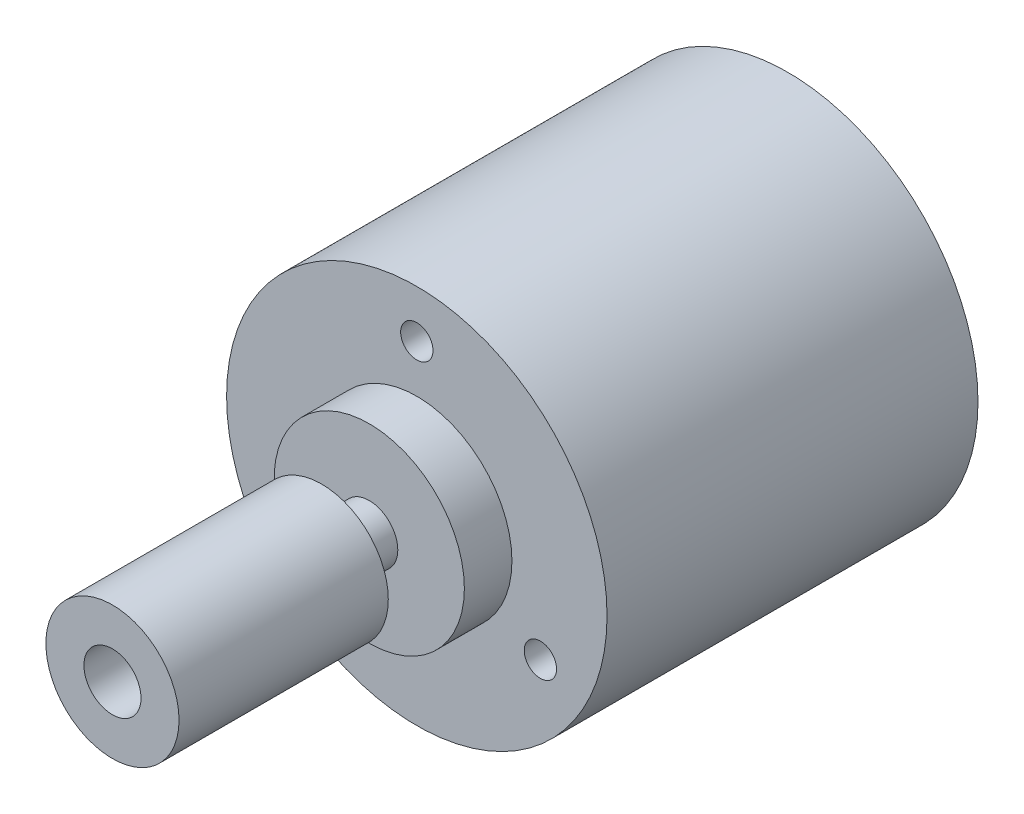
ISO-10303-21;
HEADER;
FILE_DESCRIPTION(('STEP AP214'),'2;1');
FILE_NAME('part.step','',(''),(''),'','','');
FILE_SCHEMA(('AUTOMOTIVE_DESIGN { 1 0 10303 214 1 1 1 1 }'));
ENDSEC;
DATA;
#1=APPLICATION_CONTEXT('core data for automotive mechanical design processes');
#2=APPLICATION_PROTOCOL_DEFINITION('international standard','automotive_design',2000,#1);
#3=PRODUCT_CONTEXT('',#1,'mechanical');
#4=PRODUCT('Part','Part','',(#3));
#5=PRODUCT_RELATED_PRODUCT_CATEGORY('part','',(#4));
#6=PRODUCT_DEFINITION_FORMATION('','',#4);
#7=PRODUCT_DEFINITION_CONTEXT('part definition',#1,'design');
#8=PRODUCT_DEFINITION('design','',#6,#7);
#9=PRODUCT_DEFINITION_SHAPE('','',#8);
#10=(LENGTH_UNIT() NAMED_UNIT(*) SI_UNIT(.MILLI.,.METRE.));
#11=(NAMED_UNIT(*) PLANE_ANGLE_UNIT() SI_UNIT($,.RADIAN.));
#12=(NAMED_UNIT(*) SI_UNIT($,.STERADIAN.) SOLID_ANGLE_UNIT());
#13=UNCERTAINTY_MEASURE_WITH_UNIT(LENGTH_MEASURE(1.E-05),#10,'distance_accuracy_value','');
#14=(GEOMETRIC_REPRESENTATION_CONTEXT(3) GLOBAL_UNCERTAINTY_ASSIGNED_CONTEXT((#13)) GLOBAL_UNIT_ASSIGNED_CONTEXT((#10,
#11,#12)) REPRESENTATION_CONTEXT('',''));
#15=CARTESIAN_POINT('',(0.,0.,0.));
#16=DIRECTION('',(0.,0.,1.));
#17=DIRECTION('',(1.,0.,0.));
#18=AXIS2_PLACEMENT_3D('',#15,#16,#17);
#19=CARTESIAN_POINT('',(0.,0.,10.));
#20=DIRECTION('',(0.,0.,-1.));
#21=DIRECTION('',(-1.,0.,0.));
#22=AXIS2_PLACEMENT_3D('',#19,#20,#21);
#23=CYLINDRICAL_SURFACE('',#22,3.);
#24=CARTESIAN_POINT('',(0.,0.,5.));
#25=DIRECTION('',(0.,0.,1.));
#26=DIRECTION('',(1.,0.,0.));
#27=AXIS2_PLACEMENT_3D('',#24,#25,#26);
#28=CIRCLE('',#27,3.);
#29=CARTESIAN_POINT('',(3.,0.,5.));
#30=VERTEX_POINT('',#29);
#31=EDGE_CURVE('E11',#30,#30,#28,.T.);
#32=ORIENTED_EDGE('',*,*,#31,.T.);
#33=EDGE_LOOP('',(#32));
#34=FACE_BOUND('',#33,.T.);
#35=CARTESIAN_POINT('',(0.,0.,10.));
#36=DIRECTION('',(0.,0.,1.));
#37=DIRECTION('',(1.,0.,0.));
#38=AXIS2_PLACEMENT_3D('',#35,#36,#37);
#39=CIRCLE('',#38,3.);
#40=CARTESIAN_POINT('',(3.,0.,10.));
#41=VERTEX_POINT('',#40);
#42=EDGE_CURVE('E85',#41,#41,#39,.T.);
#43=ORIENTED_EDGE('',*,*,#42,.F.);
#44=EDGE_LOOP('',(#43));
#45=FACE_BOUND('',#44,.T.);
#46=ADVANCED_FACE('F33',(#34,#45),#23,.T.);
#47=CARTESIAN_POINT('',(0.,0.,-39.));
#48=DIRECTION('',(0.,0.,1.));
#49=DIRECTION('',(1.,0.,0.));
#50=AXIS2_PLACEMENT_3D('',#47,#48,#49);
#51=CYLINDRICAL_SURFACE('',#50,20.);
#52=CARTESIAN_POINT('',(0.,0.,-39.));
#53=DIRECTION('',(0.,0.,1.));
#54=DIRECTION('',(1.,0.,0.));
#55=AXIS2_PLACEMENT_3D('',#52,#53,#54);
#56=CIRCLE('',#55,20.);
#57=CARTESIAN_POINT('',(20.,0.,-39.));
#58=VERTEX_POINT('',#57);
#59=EDGE_CURVE('E92',#58,#58,#56,.T.);
#60=ORIENTED_EDGE('',*,*,#59,.T.);
#61=EDGE_LOOP('',(#60));
#62=FACE_BOUND('',#61,.T.);
#63=CARTESIAN_POINT('',(0.,0.,0.));
#64=DIRECTION('',(0.,0.,1.));
#65=DIRECTION('',(1.,0.,0.));
#66=AXIS2_PLACEMENT_3D('',#63,#64,#65);
#67=CIRCLE('',#66,20.);
#68=CARTESIAN_POINT('',(20.,0.,0.));
#69=VERTEX_POINT('',#68);
#70=EDGE_CURVE('E37',#69,#69,#67,.T.);
#71=ORIENTED_EDGE('',*,*,#70,.F.);
#72=EDGE_LOOP('',(#71));
#73=FACE_BOUND('',#72,.T.);
#74=ADVANCED_FACE('F35',(#62,#73),#51,.T.);
#75=CARTESIAN_POINT('',(0.,0.,-39.));
#76=DIRECTION('',(0.,0.,1.));
#77=DIRECTION('',(1.,0.,0.));
#78=AXIS2_PLACEMENT_3D('',#75,#76,#77);
#79=PLANE('',#78);
#80=ORIENTED_EDGE('',*,*,#59,.F.);
#81=EDGE_LOOP('',(#80));
#82=FACE_BOUND('',#81,.T.);
#83=ADVANCED_FACE('F102',(#82),#79,.F.);
#84=CARTESIAN_POINT('',(0.,0.,0.));
#85=DIRECTION('',(0.,0.,1.));
#86=DIRECTION('',(1.,0.,0.));
#87=AXIS2_PLACEMENT_3D('',#84,#85,#86);
#88=PLANE('',#87);
#89=CARTESIAN_POINT('',(0.,15.,0.));
#90=DIRECTION('',(0.,0.,1.));
#91=DIRECTION('',(1.,0.,0.));
#92=AXIS2_PLACEMENT_3D('',#89,#90,#91);
#93=CIRCLE('',#92,1.7);
#94=CARTESIAN_POINT('',(1.7,15.,0.));
#95=VERTEX_POINT('',#94);
#96=EDGE_CURVE('E64',#95,#95,#93,.T.);
#97=ORIENTED_EDGE('',*,*,#96,.F.);
#98=EDGE_LOOP('',(#97));
#99=FACE_BOUND('',#98,.T.);
#100=CARTESIAN_POINT('',(12.9918810567675,-7.49913397459573,0.));
#101=DIRECTION('',(0.,0.,1.));
#102=DIRECTION('',(1.,0.,0.));
#103=AXIS2_PLACEMENT_3D('',#100,#101,#102);
#104=CIRCLE('',#103,1.7);
#105=CARTESIAN_POINT('',(14.6918810567675,-7.49913397459573,0.));
#106=VERTEX_POINT('',#105);
#107=EDGE_CURVE('E63',#106,#106,#104,.T.);
#108=ORIENTED_EDGE('',*,*,#107,.F.);
#109=EDGE_LOOP('',(#108));
#110=FACE_BOUND('',#109,.T.);
#111=CARTESIAN_POINT('',(-12.9888810567657,-7.50086602540422,0.));
#112=DIRECTION('',(0.,0.,1.));
#113=DIRECTION('',(1.,0.,0.));
#114=AXIS2_PLACEMENT_3D('',#111,#112,#113);
#115=CIRCLE('',#114,1.7);
#116=CARTESIAN_POINT('',(-11.2888810567657,-7.50086602540422,0.));
#117=VERTEX_POINT('',#116);
#118=EDGE_CURVE('E76',#117,#117,#115,.T.);
#119=ORIENTED_EDGE('',*,*,#118,.F.);
#120=EDGE_LOOP('',(#119));
#121=FACE_BOUND('',#120,.T.);
#122=CARTESIAN_POINT('',(0.,0.,0.));
#123=DIRECTION('',(0.,0.,1.));
#124=DIRECTION('',(1.,0.,0.));
#125=AXIS2_PLACEMENT_3D('',#122,#123,#124);
#126=CIRCLE('',#125,10.);
#127=CARTESIAN_POINT('',(10.,0.,0.));
#128=VERTEX_POINT('',#127);
#129=EDGE_CURVE('E42',#128,#128,#126,.T.);
#130=ORIENTED_EDGE('',*,*,#129,.F.);
#131=EDGE_LOOP('',(#130));
#132=FACE_BOUND('',#131,.T.);
#133=ORIENTED_EDGE('',*,*,#70,.T.);
#134=EDGE_LOOP('',(#133));
#135=FACE_BOUND('',#134,.T.);
#136=ADVANCED_FACE('F99',(#99,#110,#121,#132,#135),#88,.T.);
#137=CARTESIAN_POINT('',(0.,0.,5.));
#138=DIRECTION('',(0.,0.,-1.));
#139=DIRECTION('',(-1.,0.,0.));
#140=AXIS2_PLACEMENT_3D('',#137,#138,#139);
#141=CYLINDRICAL_SURFACE('',#140,10.);
#142=CARTESIAN_POINT('',(0.,0.,5.));
#143=DIRECTION('',(0.,0.,1.));
#144=DIRECTION('',(1.,0.,0.));
#145=AXIS2_PLACEMENT_3D('',#142,#143,#144);
#146=CIRCLE('',#145,10.);
#147=CARTESIAN_POINT('',(10.,0.,5.));
#148=VERTEX_POINT('',#147);
#149=EDGE_CURVE('E87',#148,#148,#146,.T.);
#150=ORIENTED_EDGE('',*,*,#149,.F.);
#151=EDGE_LOOP('',(#150));
#152=FACE_BOUND('',#151,.T.);
#153=ORIENTED_EDGE('',*,*,#129,.T.);
#154=EDGE_LOOP('',(#153));
#155=FACE_BOUND('',#154,.T.);
#156=ADVANCED_FACE('F122',(#152,#155),#141,.T.);
#157=CARTESIAN_POINT('',(0.,0.,5.));
#158=DIRECTION('',(0.,0.,1.));
#159=DIRECTION('',(1.,0.,0.));
#160=AXIS2_PLACEMENT_3D('',#157,#158,#159);
#161=PLANE('',#160);
#162=ORIENTED_EDGE('',*,*,#31,.F.);
#163=EDGE_LOOP('',(#162));
#164=FACE_BOUND('',#163,.T.);
#165=ORIENTED_EDGE('',*,*,#149,.T.);
#166=EDGE_LOOP('',(#165));
#167=FACE_BOUND('',#166,.T.);
#168=ADVANCED_FACE('F118',(#164,#167),#161,.T.);
#169=CARTESIAN_POINT('',(-12.9888810567657,-7.50086602540422,-7.));
#170=DIRECTION('',(0.,0.,1.));
#171=DIRECTION('',(1.,0.,0.));
#172=AXIS2_PLACEMENT_3D('',#169,#170,#171);
#173=CONICAL_SURFACE('',#172,1.7,1.02974425867665);
#174=CARTESIAN_POINT('',(-12.9888810567657,-7.50086602540422,-8.02146305234685));
#175=VERTEX_POINT('',#174);
#176=VERTEX_LOOP('',#175);
#177=FACE_BOUND('',#176,.T.);
#178=CARTESIAN_POINT('',(-12.9888810567657,-7.50086602540422,-7.));
#179=DIRECTION('',(0.,0.,1.));
#180=DIRECTION('',(1.,0.,0.));
#181=AXIS2_PLACEMENT_3D('',#178,#179,#180);
#182=CIRCLE('',#181,1.7);
#183=CARTESIAN_POINT('',(-11.2888810567657,-7.50086602540422,-7.));
#184=VERTEX_POINT('',#183);
#185=EDGE_CURVE('E79',#184,#184,#182,.T.);
#186=ORIENTED_EDGE('',*,*,#185,.T.);
#187=EDGE_LOOP('',(#186));
#188=FACE_BOUND('',#187,.T.);
#189=ADVANCED_FACE('F121',(#177,#188),#173,.F.);
#190=CARTESIAN_POINT('',(-12.9888810567657,-7.50086602540422,0.));
#191=DIRECTION('',(0.,0.,1.));
#192=DIRECTION('',(1.,0.,0.));
#193=AXIS2_PLACEMENT_3D('',#190,#191,#192);
#194=CYLINDRICAL_SURFACE('',#193,1.7);
#195=ORIENTED_EDGE('',*,*,#185,.F.);
#196=EDGE_LOOP('',(#195));
#197=FACE_BOUND('',#196,.T.);
#198=ORIENTED_EDGE('',*,*,#118,.T.);
#199=EDGE_LOOP('',(#198));
#200=FACE_BOUND('',#199,.T.);
#201=ADVANCED_FACE('F139',(#197,#200),#194,.F.);
#202=CARTESIAN_POINT('',(12.9918810567675,-7.49913397459573,-7.));
#203=DIRECTION('',(0.,0.,1.));
#204=DIRECTION('',(1.,0.,0.));
#205=AXIS2_PLACEMENT_3D('',#202,#203,#204);
#206=CONICAL_SURFACE('',#205,1.7,1.02974425867665);
#207=CARTESIAN_POINT('',(12.9918810567675,-7.49913397459573,-8.02146305234685));
#208=VERTEX_POINT('',#207);
#209=VERTEX_LOOP('',#208);
#210=FACE_BOUND('',#209,.T.);
#211=CARTESIAN_POINT('',(12.9918810567675,-7.49913397459573,-7.));
#212=DIRECTION('',(0.,0.,1.));
#213=DIRECTION('',(1.,0.,0.));
#214=AXIS2_PLACEMENT_3D('',#211,#212,#213);
#215=CIRCLE('',#214,1.7);
#216=CARTESIAN_POINT('',(14.6918810567675,-7.49913397459573,-7.));
#217=VERTEX_POINT('',#216);
#218=EDGE_CURVE('E67',#217,#217,#215,.T.);
#219=ORIENTED_EDGE('',*,*,#218,.T.);
#220=EDGE_LOOP('',(#219));
#221=FACE_BOUND('',#220,.T.);
#222=ADVANCED_FACE('F141',(#210,#221),#206,.F.);
#223=CARTESIAN_POINT('',(12.9918810567675,-7.49913397459573,0.));
#224=DIRECTION('',(0.,0.,1.));
#225=DIRECTION('',(1.,0.,0.));
#226=AXIS2_PLACEMENT_3D('',#223,#224,#225);
#227=CYLINDRICAL_SURFACE('',#226,1.7);
#228=ORIENTED_EDGE('',*,*,#218,.F.);
#229=EDGE_LOOP('',(#228));
#230=FACE_BOUND('',#229,.T.);
#231=ORIENTED_EDGE('',*,*,#107,.T.);
#232=EDGE_LOOP('',(#231));
#233=FACE_BOUND('',#232,.T.);
#234=ADVANCED_FACE('F57',(#230,#233),#227,.F.);
#235=CARTESIAN_POINT('',(0.,15.,-7.));
#236=DIRECTION('',(0.,0.,1.));
#237=DIRECTION('',(1.,0.,0.));
#238=AXIS2_PLACEMENT_3D('',#235,#236,#237);
#239=CONICAL_SURFACE('',#238,1.7,1.02974425867665);
#240=CARTESIAN_POINT('',(0.,15.,-8.02146305234685));
#241=VERTEX_POINT('',#240);
#242=VERTEX_LOOP('',#241);
#243=FACE_BOUND('',#242,.T.);
#244=CARTESIAN_POINT('',(0.,15.,-7.));
#245=DIRECTION('',(0.,0.,1.));
#246=DIRECTION('',(1.,0.,0.));
#247=AXIS2_PLACEMENT_3D('',#244,#245,#246);
#248=CIRCLE('',#247,1.7);
#249=CARTESIAN_POINT('',(1.7,15.,-7.));
#250=VERTEX_POINT('',#249);
#251=EDGE_CURVE('E61',#250,#250,#248,.T.);
#252=ORIENTED_EDGE('',*,*,#251,.T.);
#253=EDGE_LOOP('',(#252));
#254=FACE_BOUND('',#253,.T.);
#255=ADVANCED_FACE('F53',(#243,#254),#239,.F.);
#256=CARTESIAN_POINT('',(0.,15.,0.));
#257=DIRECTION('',(0.,0.,1.));
#258=DIRECTION('',(1.,0.,0.));
#259=AXIS2_PLACEMENT_3D('',#256,#257,#258);
#260=CYLINDRICAL_SURFACE('',#259,1.7);
#261=ORIENTED_EDGE('',*,*,#251,.F.);
#262=EDGE_LOOP('',(#261));
#263=FACE_BOUND('',#262,.T.);
#264=ORIENTED_EDGE('',*,*,#96,.T.);
#265=EDGE_LOOP('',(#264));
#266=FACE_BOUND('',#265,.T.);
#267=ADVANCED_FACE('F56',(#263,#266),#260,.F.);
#268=CARTESIAN_POINT('',(0.,0.,10.));
#269=DIRECTION('',(0.,0.,1.));
#270=DIRECTION('',(1.,0.,0.));
#271=AXIS2_PLACEMENT_3D('',#268,#269,#270);
#272=PLANE('',#271);
#273=CARTESIAN_POINT('',(0.,0.,10.));
#274=DIRECTION('',(0.,0.,1.));
#275=DIRECTION('',(1.,0.,0.));
#276=AXIS2_PLACEMENT_3D('',#273,#274,#275);
#277=CIRCLE('',#276,7.);
#278=CARTESIAN_POINT('',(7.,0.,10.));
#279=VERTEX_POINT('',#278);
#280=EDGE_CURVE('E180',#279,#279,#277,.T.);
#281=ORIENTED_EDGE('',*,*,#280,.F.);
#282=EDGE_LOOP('',(#281));
#283=FACE_BOUND('',#282,.T.);
#284=ORIENTED_EDGE('',*,*,#42,.T.);
#285=EDGE_LOOP('',(#284));
#286=FACE_BOUND('',#285,.T.);
#287=ADVANCED_FACE('F156',(#283,#286),#272,.F.);
#288=CARTESIAN_POINT('',(0.,0.,32.));
#289=DIRECTION('',(0.,0.,1.));
#290=DIRECTION('',(1.,0.,0.));
#291=AXIS2_PLACEMENT_3D('',#288,#289,#290);
#292=PLANE('',#291);
#293=CARTESIAN_POINT('',(0.,0.,32.));
#294=DIRECTION('',(0.,0.,1.));
#295=DIRECTION('',(1.,0.,0.));
#296=AXIS2_PLACEMENT_3D('',#293,#294,#295);
#297=CIRCLE('',#296,3.);
#298=CARTESIAN_POINT('',(3.,0.,32.));
#299=VERTEX_POINT('',#298);
#300=EDGE_CURVE('E179',#299,#299,#297,.T.);
#301=ORIENTED_EDGE('',*,*,#300,.F.);
#302=EDGE_LOOP('',(#301));
#303=FACE_BOUND('',#302,.T.);
#304=CARTESIAN_POINT('',(0.,0.,32.));
#305=DIRECTION('',(0.,0.,1.));
#306=DIRECTION('',(1.,0.,0.));
#307=AXIS2_PLACEMENT_3D('',#304,#305,#306);
#308=CIRCLE('',#307,7.);
#309=CARTESIAN_POINT('',(7.,0.,32.));
#310=VERTEX_POINT('',#309);
#311=EDGE_CURVE('E70',#310,#310,#308,.T.);
#312=ORIENTED_EDGE('',*,*,#311,.T.);
#313=EDGE_LOOP('',(#312));
#314=FACE_BOUND('',#313,.T.);
#315=ADVANCED_FACE('F161',(#303,#314),#292,.T.);
#316=CARTESIAN_POINT('',(0.,0.,32.));
#317=DIRECTION('',(0.,0.,-1.));
#318=DIRECTION('',(-1.,0.,0.));
#319=AXIS2_PLACEMENT_3D('',#316,#317,#318);
#320=CYLINDRICAL_SURFACE('',#319,7.);
#321=ORIENTED_EDGE('',*,*,#311,.F.);
#322=EDGE_LOOP('',(#321));
#323=FACE_BOUND('',#322,.T.);
#324=ORIENTED_EDGE('',*,*,#280,.T.);
#325=EDGE_LOOP('',(#324));
#326=FACE_BOUND('',#325,.T.);
#327=ADVANCED_FACE('F157',(#323,#326),#320,.T.);
#328=CARTESIAN_POINT('',(0.,0.,32.));
#329=DIRECTION('',(0.,0.,-1.));
#330=DIRECTION('',(-1.,0.,0.));
#331=AXIS2_PLACEMENT_3D('',#328,#329,#330);
#332=CYLINDRICAL_SURFACE('',#331,3.);
#333=CARTESIAN_POINT('',(0.,0.,20.));
#334=DIRECTION('',(0.,0.,1.));
#335=DIRECTION('',(1.,0.,0.));
#336=AXIS2_PLACEMENT_3D('',#333,#334,#335);
#337=CIRCLE('',#336,3.);
#338=CARTESIAN_POINT('',(3.,0.,20.));
#339=VERTEX_POINT('',#338);
#340=EDGE_CURVE('E82',#339,#339,#337,.T.);
#341=ORIENTED_EDGE('',*,*,#340,.F.);
#342=EDGE_LOOP('',(#341));
#343=FACE_BOUND('',#342,.T.);
#344=ORIENTED_EDGE('',*,*,#300,.T.);
#345=EDGE_LOOP('',(#344));
#346=FACE_BOUND('',#345,.T.);
#347=ADVANCED_FACE('F160',(#343,#346),#332,.F.);
#348=CARTESIAN_POINT('',(0.,0.,20.));
#349=DIRECTION('',(0.,0.,1.));
#350=DIRECTION('',(1.,0.,0.));
#351=AXIS2_PLACEMENT_3D('',#348,#349,#350);
#352=PLANE('',#351);
#353=ORIENTED_EDGE('',*,*,#340,.T.);
#354=EDGE_LOOP('',(#353));
#355=FACE_BOUND('',#354,.T.);
#356=ADVANCED_FACE('F116',(#355),#352,.T.);
#357=CLOSED_SHELL('',(#46,#74,#83,#136,#156,#168,#189,#201,#222,#234,#255,#267,#287,#315,#327,
#347,#356));
#358=MANIFOLD_SOLID_BREP('B2',#357);
#359=ADVANCED_BREP_SHAPE_REPRESENTATION('',(#18,#358),#14);
#360=SHAPE_DEFINITION_REPRESENTATION(#9,#359);
ENDSEC;
END-ISO-10303-21;
